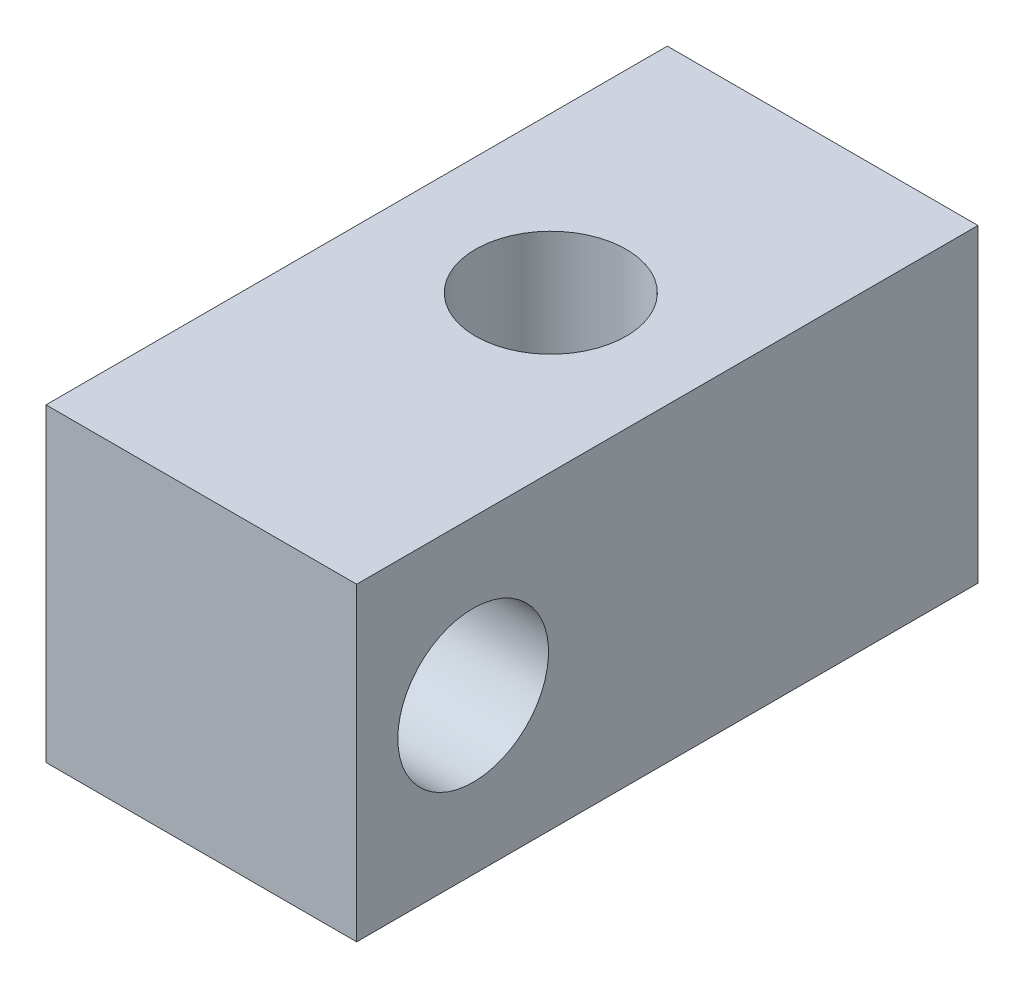
ISO-10303-21;
HEADER;
FILE_DESCRIPTION(('STEP AP214'),'2;1');
FILE_NAME('part.step','',(''),(''),'','','');
FILE_SCHEMA(('AUTOMOTIVE_DESIGN { 1 0 10303 214 1 1 1 1 }'));
ENDSEC;
DATA;
#1=APPLICATION_CONTEXT('core data for automotive mechanical design processes');
#2=APPLICATION_PROTOCOL_DEFINITION('international standard','automotive_design',2000,#1);
#3=PRODUCT_CONTEXT('',#1,'mechanical');
#4=PRODUCT('Part','Part','',(#3));
#5=PRODUCT_RELATED_PRODUCT_CATEGORY('part','',(#4));
#6=PRODUCT_DEFINITION_FORMATION('','',#4);
#7=PRODUCT_DEFINITION_CONTEXT('part definition',#1,'design');
#8=PRODUCT_DEFINITION('design','',#6,#7);
#9=PRODUCT_DEFINITION_SHAPE('','',#8);
#10=(LENGTH_UNIT() NAMED_UNIT(*) SI_UNIT(.MILLI.,.METRE.));
#11=(NAMED_UNIT(*) PLANE_ANGLE_UNIT() SI_UNIT($,.RADIAN.));
#12=(NAMED_UNIT(*) SI_UNIT($,.STERADIAN.) SOLID_ANGLE_UNIT());
#13=UNCERTAINTY_MEASURE_WITH_UNIT(LENGTH_MEASURE(1.E-05),#10,'distance_accuracy_value','');
#14=(GEOMETRIC_REPRESENTATION_CONTEXT(3) GLOBAL_UNCERTAINTY_ASSIGNED_CONTEXT((#13)) GLOBAL_UNIT_ASSIGNED_CONTEXT((#10,
#11,#12)) REPRESENTATION_CONTEXT('',''));
#15=CARTESIAN_POINT('',(0.,0.,0.));
#16=DIRECTION('',(0.,0.,1.));
#17=DIRECTION('',(1.,0.,0.));
#18=AXIS2_PLACEMENT_3D('',#15,#16,#17);
#19=CARTESIAN_POINT('',(0.,0.,20.));
#20=DIRECTION('',(-1.,0.,0.));
#21=DIRECTION('',(0.,0.,1.));
#22=AXIS2_PLACEMENT_3D('',#19,#20,#21);
#23=PLANE('',#22);
#24=CARTESIAN_POINT('',(0.,5.,16.25));
#25=DIRECTION('',(-1.,0.,0.));
#26=DIRECTION('',(0.,0.,1.));
#27=AXIS2_PLACEMENT_3D('',#24,#25,#26);
#28=CIRCLE('',#27,2.4257);
#29=CARTESIAN_POINT('',(0.,5.,18.6757));
#30=VERTEX_POINT('',#29);
#31=EDGE_CURVE('E174',#30,#30,#28,.T.);
#32=ORIENTED_EDGE('',*,*,#31,.T.);
#33=EDGE_LOOP('',(#32));
#34=FACE_BOUND('',#33,.T.);
#35=DIRECTION('',(0.,1.,0.));
#36=VECTOR('',#35,1.);
#37=CARTESIAN_POINT('',(0.,0.,0.));
#38=LINE('',#37,#36);
#39=CARTESIAN_POINT('',(0.,0.,0.));
#40=VERTEX_POINT('',#39);
#41=CARTESIAN_POINT('',(0.,9.97093023255813,0.));
#42=VERTEX_POINT('',#41);
#43=EDGE_CURVE('E108',#40,#42,#38,.T.);
#44=ORIENTED_EDGE('',*,*,#43,.T.);
#45=DIRECTION('',(0.,0.,-1.));
#46=VECTOR('',#45,1.);
#47=CARTESIAN_POINT('',(0.,9.97093023255813,20.));
#48=LINE('',#47,#46);
#49=CARTESIAN_POINT('',(0.,9.97093023255813,20.));
#50=VERTEX_POINT('',#49);
#51=EDGE_CURVE('E11',#50,#42,#48,.T.);
#52=ORIENTED_EDGE('',*,*,#51,.F.);
#53=DIRECTION('',(0.,1.,0.));
#54=VECTOR('',#53,1.);
#55=CARTESIAN_POINT('',(0.,0.,20.));
#56=LINE('',#55,#54);
#57=CARTESIAN_POINT('',(0.,0.,20.));
#58=VERTEX_POINT('',#57);
#59=EDGE_CURVE('E121',#58,#50,#56,.T.);
#60=ORIENTED_EDGE('',*,*,#59,.F.);
#61=DIRECTION('',(0.,0.,-1.));
#62=VECTOR('',#61,1.);
#63=CARTESIAN_POINT('',(0.,0.,20.));
#64=LINE('',#63,#62);
#65=EDGE_CURVE('E130',#58,#40,#64,.T.);
#66=ORIENTED_EDGE('',*,*,#65,.T.);
#67=EDGE_LOOP('',(#44,#52,#60,#66));
#68=FACE_BOUND('',#67,.T.);
#69=ADVANCED_FACE('F45',(#34,#68),#23,.F.);
#70=CARTESIAN_POINT('',(0.,9.97093023255813,20.));
#71=DIRECTION('',(0.,-1.,0.));
#72=DIRECTION('',(0.,0.,-1.));
#73=AXIS2_PLACEMENT_3D('',#70,#71,#72);
#74=PLANE('',#73);
#75=CARTESIAN_POINT('',(-5.,9.97093023255813,8.75));
#76=DIRECTION('',(0.,1.,0.));
#77=DIRECTION('',(0.,0.,1.));
#78=AXIS2_PLACEMENT_3D('',#75,#76,#77);
#79=CIRCLE('',#78,2.42569999999999);
#80=CARTESIAN_POINT('',(-5.,9.97093023255813,11.1757));
#81=VERTEX_POINT('',#80);
#82=EDGE_CURVE('E177',#81,#81,#79,.T.);
#83=ORIENTED_EDGE('',*,*,#82,.F.);
#84=EDGE_LOOP('',(#83));
#85=FACE_BOUND('',#84,.T.);
#86=DIRECTION('',(-1.,0.,0.));
#87=VECTOR('',#86,1.);
#88=CARTESIAN_POINT('',(0.,9.97093023255813,0.));
#89=LINE('',#88,#87);
#90=CARTESIAN_POINT('',(-10.,9.97093023255813,0.));
#91=VERTEX_POINT('',#90);
#92=EDGE_CURVE('E114',#42,#91,#89,.T.);
#93=ORIENTED_EDGE('',*,*,#92,.T.);
#94=DIRECTION('',(0.,0.,-1.));
#95=VECTOR('',#94,1.);
#96=CARTESIAN_POINT('',(-10.,9.97093023255813,20.));
#97=LINE('',#96,#95);
#98=CARTESIAN_POINT('',(-10.,9.97093023255813,20.));
#99=VERTEX_POINT('',#98);
#100=EDGE_CURVE('E54',#99,#91,#97,.T.);
#101=ORIENTED_EDGE('',*,*,#100,.F.);
#102=DIRECTION('',(-1.,0.,0.));
#103=VECTOR('',#102,1.);
#104=CARTESIAN_POINT('',(0.,9.97093023255813,20.));
#105=LINE('',#104,#103);
#106=EDGE_CURVE('E93',#50,#99,#105,.T.);
#107=ORIENTED_EDGE('',*,*,#106,.F.);
#108=ORIENTED_EDGE('',*,*,#51,.T.);
#109=EDGE_LOOP('',(#93,#101,#107,#108));
#110=FACE_BOUND('',#109,.T.);
#111=ADVANCED_FACE('F162',(#85,#110),#74,.F.);
#112=CARTESIAN_POINT('',(-10.,0.,20.));
#113=DIRECTION('',(1.,0.,0.));
#114=DIRECTION('',(0.,0.,-1.));
#115=AXIS2_PLACEMENT_3D('',#112,#113,#114);
#116=PLANE('',#115);
#117=CARTESIAN_POINT('',(-10.,5.,16.25));
#118=DIRECTION('',(-1.,0.,0.));
#119=DIRECTION('',(0.,0.,1.));
#120=AXIS2_PLACEMENT_3D('',#117,#118,#119);
#121=CIRCLE('',#120,2.42569999999999);
#122=CARTESIAN_POINT('',(-10.,5.,18.6757));
#123=VERTEX_POINT('',#122);
#124=EDGE_CURVE('E178',#123,#123,#121,.T.);
#125=ORIENTED_EDGE('',*,*,#124,.F.);
#126=EDGE_LOOP('',(#125));
#127=FACE_BOUND('',#126,.T.);
#128=DIRECTION('',(0.,-1.,0.));
#129=VECTOR('',#128,1.);
#130=CARTESIAN_POINT('',(-10.,0.,0.));
#131=LINE('',#130,#129);
#132=CARTESIAN_POINT('',(-10.,0.,0.));
#133=VERTEX_POINT('',#132);
#134=EDGE_CURVE('E80',#91,#133,#131,.T.);
#135=ORIENTED_EDGE('',*,*,#134,.T.);
#136=DIRECTION('',(0.,0.,-1.));
#137=VECTOR('',#136,1.);
#138=CARTESIAN_POINT('',(-10.,0.,20.));
#139=LINE('',#138,#137);
#140=CARTESIAN_POINT('',(-10.,0.,20.));
#141=VERTEX_POINT('',#140);
#142=EDGE_CURVE('E140',#141,#133,#139,.T.);
#143=ORIENTED_EDGE('',*,*,#142,.F.);
#144=DIRECTION('',(0.,-1.,0.));
#145=VECTOR('',#144,1.);
#146=CARTESIAN_POINT('',(-10.,0.,20.));
#147=LINE('',#146,#145);
#148=EDGE_CURVE('E126',#99,#141,#147,.T.);
#149=ORIENTED_EDGE('',*,*,#148,.F.);
#150=ORIENTED_EDGE('',*,*,#100,.T.);
#151=EDGE_LOOP('',(#135,#143,#149,#150));
#152=FACE_BOUND('',#151,.T.);
#153=ADVANCED_FACE('F144',(#127,#152),#116,.F.);
#154=CARTESIAN_POINT('',(0.,0.,20.));
#155=DIRECTION('',(0.,1.,0.));
#156=DIRECTION('',(0.,0.,1.));
#157=AXIS2_PLACEMENT_3D('',#154,#155,#156);
#158=PLANE('',#157);
#159=CARTESIAN_POINT('',(-5.,0.,8.75));
#160=DIRECTION('',(0.,1.,0.));
#161=DIRECTION('',(0.,0.,1.));
#162=AXIS2_PLACEMENT_3D('',#159,#160,#161);
#163=CIRCLE('',#162,2.4257);
#164=CARTESIAN_POINT('',(-5.,0.,11.1757));
#165=VERTEX_POINT('',#164);
#166=EDGE_CURVE('E117',#165,#165,#163,.T.);
#167=ORIENTED_EDGE('',*,*,#166,.T.);
#168=EDGE_LOOP('',(#167));
#169=FACE_BOUND('',#168,.T.);
#170=DIRECTION('',(1.,0.,0.));
#171=VECTOR('',#170,1.);
#172=CARTESIAN_POINT('',(0.,0.,0.));
#173=LINE('',#172,#171);
#174=EDGE_CURVE('E86',#133,#40,#173,.T.);
#175=ORIENTED_EDGE('',*,*,#174,.T.);
#176=ORIENTED_EDGE('',*,*,#65,.F.);
#177=DIRECTION('',(1.,0.,0.));
#178=VECTOR('',#177,1.);
#179=CARTESIAN_POINT('',(0.,0.,20.));
#180=LINE('',#179,#178);
#181=EDGE_CURVE('E62',#141,#58,#180,.T.);
#182=ORIENTED_EDGE('',*,*,#181,.F.);
#183=ORIENTED_EDGE('',*,*,#142,.T.);
#184=EDGE_LOOP('',(#175,#176,#182,#183));
#185=FACE_BOUND('',#184,.T.);
#186=ADVANCED_FACE('F150',(#169,#185),#158,.F.);
#187=CARTESIAN_POINT('',(0.,0.,20.));
#188=DIRECTION('',(0.,0.,1.));
#189=DIRECTION('',(1.,0.,0.));
#190=AXIS2_PLACEMENT_3D('',#187,#188,#189);
#191=PLANE('',#190);
#192=ORIENTED_EDGE('',*,*,#59,.T.);
#193=ORIENTED_EDGE('',*,*,#106,.T.);
#194=ORIENTED_EDGE('',*,*,#148,.T.);
#195=ORIENTED_EDGE('',*,*,#181,.T.);
#196=EDGE_LOOP('',(#192,#193,#194,#195));
#197=FACE_BOUND('',#196,.T.);
#198=ADVANCED_FACE('F152',(#197),#191,.T.);
#199=CARTESIAN_POINT('',(0.,0.,0.));
#200=DIRECTION('',(0.,0.,1.));
#201=DIRECTION('',(1.,0.,0.));
#202=AXIS2_PLACEMENT_3D('',#199,#200,#201);
#203=PLANE('',#202);
#204=CARTESIAN_POINT('',(-5.,4.98546511627907,0.));
#205=DIRECTION('',(0.,0.,-1.));
#206=DIRECTION('',(-1.,0.,0.));
#207=AXIS2_PLACEMENT_3D('',#204,#205,#206);
#208=CIRCLE('',#207,2.42569999999999);
#209=CARTESIAN_POINT('',(-7.42569999999999,4.98546511627907,0.));
#210=VERTEX_POINT('',#209);
#211=EDGE_CURVE('E109',#210,#210,#208,.T.);
#212=ORIENTED_EDGE('',*,*,#211,.F.);
#213=EDGE_LOOP('',(#212));
#214=FACE_BOUND('',#213,.T.);
#215=ORIENTED_EDGE('',*,*,#43,.F.);
#216=ORIENTED_EDGE('',*,*,#174,.F.);
#217=ORIENTED_EDGE('',*,*,#134,.F.);
#218=ORIENTED_EDGE('',*,*,#92,.F.);
#219=EDGE_LOOP('',(#215,#216,#217,#218));
#220=FACE_BOUND('',#219,.T.);
#221=ADVANCED_FACE('F101',(#214,#220),#203,.F.);
#222=CARTESIAN_POINT('',(-5.,4.98546511627907,4.));
#223=DIRECTION('',(0.,0.,-1.));
#224=DIRECTION('',(-1.,0.,0.));
#225=AXIS2_PLACEMENT_3D('',#222,#223,#224);
#226=CONICAL_SURFACE('',#225,2.4257,1.02974425867665);
#227=CARTESIAN_POINT('',(-5.,4.98546511627907,5.45750760357516));
#228=VERTEX_POINT('',#227);
#229=VERTEX_LOOP('',#228);
#230=FACE_BOUND('',#229,.T.);
#231=CARTESIAN_POINT('',(-5.,4.98546511627907,4.));
#232=DIRECTION('',(0.,0.,-1.));
#233=DIRECTION('',(-1.,0.,0.));
#234=AXIS2_PLACEMENT_3D('',#231,#232,#233);
#235=CIRCLE('',#234,2.4257);
#236=CARTESIAN_POINT('',(-7.4257,4.98546511627907,4.));
#237=VERTEX_POINT('',#236);
#238=EDGE_CURVE('E105',#237,#237,#235,.T.);
#239=ORIENTED_EDGE('',*,*,#238,.T.);
#240=EDGE_LOOP('',(#239));
#241=FACE_BOUND('',#240,.T.);
#242=ADVANCED_FACE('F97',(#230,#241),#226,.F.);
#243=CARTESIAN_POINT('',(-5.,4.98546511627907,0.));
#244=DIRECTION('',(0.,0.,-1.));
#245=DIRECTION('',(-1.,0.,0.));
#246=AXIS2_PLACEMENT_3D('',#243,#244,#245);
#247=CYLINDRICAL_SURFACE('',#246,2.42569999999999);
#248=ORIENTED_EDGE('',*,*,#238,.F.);
#249=EDGE_LOOP('',(#248));
#250=FACE_BOUND('',#249,.T.);
#251=ORIENTED_EDGE('',*,*,#211,.T.);
#252=EDGE_LOOP('',(#251));
#253=FACE_BOUND('',#252,.T.);
#254=ADVANCED_FACE('F100',(#250,#253),#247,.F.);
#255=CARTESIAN_POINT('',(-5.,9.97093023255813,8.75));
#256=DIRECTION('',(0.,1.,0.));
#257=DIRECTION('',(0.,0.,1.));
#258=AXIS2_PLACEMENT_3D('',#255,#256,#257);
#259=CYLINDRICAL_SURFACE('',#258,2.42569999999999);
#260=ORIENTED_EDGE('',*,*,#166,.F.);
#261=EDGE_LOOP('',(#260));
#262=FACE_BOUND('',#261,.T.);
#263=ORIENTED_EDGE('',*,*,#82,.T.);
#264=EDGE_LOOP('',(#263));
#265=FACE_BOUND('',#264,.T.);
#266=ADVANCED_FACE('F189',(#262,#265),#259,.F.);
#267=CARTESIAN_POINT('',(-10.,5.,16.25));
#268=DIRECTION('',(-1.,0.,0.));
#269=DIRECTION('',(0.,0.,1.));
#270=AXIS2_PLACEMENT_3D('',#267,#268,#269);
#271=CYLINDRICAL_SURFACE('',#270,2.42569999999999);
#272=ORIENTED_EDGE('',*,*,#31,.F.);
#273=EDGE_LOOP('',(#272));
#274=FACE_BOUND('',#273,.T.);
#275=ORIENTED_EDGE('',*,*,#124,.T.);
#276=EDGE_LOOP('',(#275));
#277=FACE_BOUND('',#276,.T.);
#278=ADVANCED_FACE('F191',(#274,#277),#271,.F.);
#279=CLOSED_SHELL('',(#69,#111,#153,#186,#198,#221,#242,#254,#266,#278));
#280=MANIFOLD_SOLID_BREP('B2',#279);
#281=ADVANCED_BREP_SHAPE_REPRESENTATION('',(#18,#280),#14);
#282=SHAPE_DEFINITION_REPRESENTATION(#9,#281);
ENDSEC;
END-ISO-10303-21;
